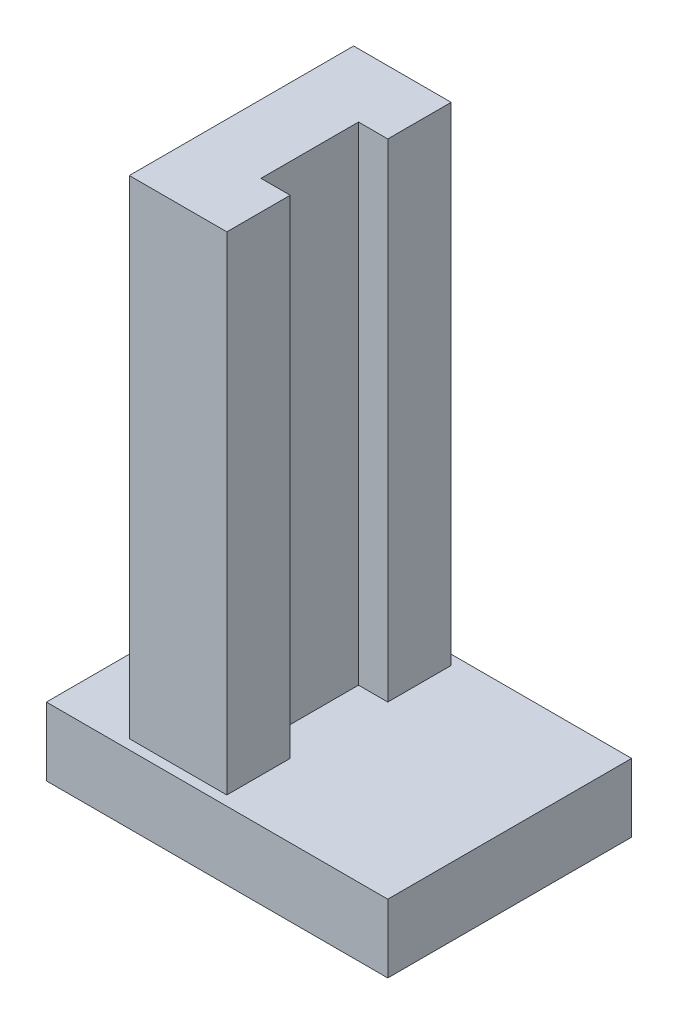
ISO-10303-21;
HEADER;
FILE_DESCRIPTION(('STEP AP214'),'2;1');
FILE_NAME('part.step','',(''),(''),'','','');
FILE_SCHEMA(('AUTOMOTIVE_DESIGN { 1 0 10303 214 1 1 1 1 }'));
ENDSEC;
DATA;
#1=APPLICATION_CONTEXT('core data for automotive mechanical design processes');
#2=APPLICATION_PROTOCOL_DEFINITION('international standard','automotive_design',2000,#1);
#3=PRODUCT_CONTEXT('',#1,'mechanical');
#4=PRODUCT('Part','Part','',(#3));
#5=PRODUCT_RELATED_PRODUCT_CATEGORY('part','',(#4));
#6=PRODUCT_DEFINITION_FORMATION('','',#4);
#7=PRODUCT_DEFINITION_CONTEXT('part definition',#1,'design');
#8=PRODUCT_DEFINITION('design','',#6,#7);
#9=PRODUCT_DEFINITION_SHAPE('','',#8);
#10=(LENGTH_UNIT() NAMED_UNIT(*) SI_UNIT(.MILLI.,.METRE.));
#11=(NAMED_UNIT(*) PLANE_ANGLE_UNIT() SI_UNIT($,.RADIAN.));
#12=(NAMED_UNIT(*) SI_UNIT($,.STERADIAN.) SOLID_ANGLE_UNIT());
#13=UNCERTAINTY_MEASURE_WITH_UNIT(LENGTH_MEASURE(1.E-05),#10,'distance_accuracy_value','');
#14=(GEOMETRIC_REPRESENTATION_CONTEXT(3) GLOBAL_UNCERTAINTY_ASSIGNED_CONTEXT((#13)) GLOBAL_UNIT_ASSIGNED_CONTEXT((#10,
#11,#12)) REPRESENTATION_CONTEXT('',''));
#15=CARTESIAN_POINT('',(0.,0.,0.));
#16=DIRECTION('',(0.,0.,1.));
#17=DIRECTION('',(1.,0.,0.));
#18=AXIS2_PLACEMENT_3D('',#15,#16,#17);
#19=CARTESIAN_POINT('',(0.,285.,57.5));
#20=DIRECTION('',(-1.,0.,0.));
#21=DIRECTION('',(0.,0.,1.));
#22=AXIS2_PLACEMENT_3D('',#19,#20,#21);
#23=PLANE('',#22);
#24=DIRECTION('',(0.,0.,-1.));
#25=VECTOR('',#24,1.);
#26=CARTESIAN_POINT('',(0.,285.,57.5));
#27=LINE('',#26,#25);
#28=CARTESIAN_POINT('',(0.,285.,-25.));
#29=VERTEX_POINT('',#28);
#30=CARTESIAN_POINT('',(0.,285.,-57.5));
#31=VERTEX_POINT('',#30);
#32=EDGE_CURVE('E157',#29,#31,#27,.T.);
#33=ORIENTED_EDGE('',*,*,#32,.F.);
#34=DIRECTION('',(0.,1.,0.));
#35=VECTOR('',#34,1.);
#36=CARTESIAN_POINT('',(0.,35.,-25.));
#37=LINE('',#36,#35);
#38=CARTESIAN_POINT('',(0.,35.,-25.));
#39=VERTEX_POINT('',#38);
#40=EDGE_CURVE('E266',#39,#29,#37,.T.);
#41=ORIENTED_EDGE('',*,*,#40,.F.);
#42=DIRECTION('',(0.,0.,-1.));
#43=VECTOR('',#42,1.);
#44=CARTESIAN_POINT('',(0.,35.,57.5));
#45=LINE('',#44,#43);
#46=CARTESIAN_POINT('',(0.,35.,-57.5));
#47=VERTEX_POINT('',#46);
#48=EDGE_CURVE('E166',#39,#47,#45,.T.);
#49=ORIENTED_EDGE('',*,*,#48,.T.);
#50=DIRECTION('',(0.,-1.,0.));
#51=VECTOR('',#50,1.);
#52=CARTESIAN_POINT('',(0.,285.,-57.5));
#53=LINE('',#52,#51);
#54=EDGE_CURVE('E174',#31,#47,#53,.T.);
#55=ORIENTED_EDGE('',*,*,#54,.F.);
#56=EDGE_LOOP('',(#33,#41,#49,#55));
#57=FACE_BOUND('',#56,.T.);
#58=ADVANCED_FACE('F34',(#57),#23,.F.);
#59=CARTESIAN_POINT('',(0.,35.,0.));
#60=DIRECTION('',(0.,-1.,0.));
#61=DIRECTION('',(0.,0.,-1.));
#62=AXIS2_PLACEMENT_3D('',#59,#60,#61);
#63=PLANE('',#62);
#64=DIRECTION('',(0.,0.,-1.));
#65=VECTOR('',#64,1.);
#66=CARTESIAN_POINT('',(87.5,35.,62.5));
#67=LINE('',#66,#65);
#68=CARTESIAN_POINT('',(87.5,35.,62.5));
#69=VERTEX_POINT('',#68);
#70=CARTESIAN_POINT('',(87.5,35.,-62.5));
#71=VERTEX_POINT('',#70);
#72=EDGE_CURVE('E183',#69,#71,#67,.T.);
#73=ORIENTED_EDGE('',*,*,#72,.T.);
#74=DIRECTION('',(-1.,0.,0.));
#75=VECTOR('',#74,1.);
#76=CARTESIAN_POINT('',(-87.5,35.,-62.5));
#77=LINE('',#76,#75);
#78=CARTESIAN_POINT('',(-87.5,35.,-62.5));
#79=VERTEX_POINT('',#78);
#80=EDGE_CURVE('E186',#71,#79,#77,.T.);
#81=ORIENTED_EDGE('',*,*,#80,.T.);
#82=DIRECTION('',(0.,0.,1.));
#83=VECTOR('',#82,1.);
#84=CARTESIAN_POINT('',(-87.5,35.,62.5));
#85=LINE('',#84,#83);
#86=CARTESIAN_POINT('',(-87.5,35.,62.5));
#87=VERTEX_POINT('',#86);
#88=EDGE_CURVE('E189',#79,#87,#85,.T.);
#89=ORIENTED_EDGE('',*,*,#88,.T.);
#90=DIRECTION('',(1.,0.,0.));
#91=VECTOR('',#90,1.);
#92=CARTESIAN_POINT('',(-87.5,35.,62.5));
#93=LINE('',#92,#91);
#94=EDGE_CURVE('E191',#87,#69,#93,.T.);
#95=ORIENTED_EDGE('',*,*,#94,.T.);
#96=EDGE_LOOP('',(#73,#81,#89,#95));
#97=FACE_BOUND('',#96,.T.);
#98=DIRECTION('',(0.,0.,1.));
#99=VECTOR('',#98,1.);
#100=CARTESIAN_POINT('',(-50.,35.,57.5));
#101=LINE('',#100,#99);
#102=CARTESIAN_POINT('',(-50.,35.,-57.5));
#103=VERTEX_POINT('',#102);
#104=CARTESIAN_POINT('',(-50.,35.,57.5));
#105=VERTEX_POINT('',#104);
#106=EDGE_CURVE('E162',#103,#105,#101,.T.);
#107=ORIENTED_EDGE('',*,*,#106,.F.);
#108=DIRECTION('',(-1.,0.,0.));
#109=VECTOR('',#108,1.);
#110=CARTESIAN_POINT('',(0.,35.,-57.5));
#111=LINE('',#110,#109);
#112=EDGE_CURVE('E155',#47,#103,#111,.T.);
#113=ORIENTED_EDGE('',*,*,#112,.F.);
#114=ORIENTED_EDGE('',*,*,#48,.F.);
#115=DIRECTION('',(1.,0.,0.));
#116=VECTOR('',#115,1.);
#117=CARTESIAN_POINT('',(-15.,35.,-25.));
#118=LINE('',#117,#116);
#119=CARTESIAN_POINT('',(-15.,35.,-25.));
#120=VERTEX_POINT('',#119);
#121=EDGE_CURVE('E146',#120,#39,#118,.T.);
#122=ORIENTED_EDGE('',*,*,#121,.F.);
#123=DIRECTION('',(0.,0.,-1.));
#124=VECTOR('',#123,1.);
#125=CARTESIAN_POINT('',(-15.,35.,25.));
#126=LINE('',#125,#124);
#127=CARTESIAN_POINT('',(-15.,35.,25.));
#128=VERTEX_POINT('',#127);
#129=EDGE_CURVE('E132',#128,#120,#126,.T.);
#130=ORIENTED_EDGE('',*,*,#129,.F.);
#131=DIRECTION('',(1.,0.,0.));
#132=VECTOR('',#131,1.);
#133=CARTESIAN_POINT('',(-15.,35.,25.));
#134=LINE('',#133,#132);
#135=CARTESIAN_POINT('',(0.,35.,25.));
#136=VERTEX_POINT('',#135);
#137=EDGE_CURVE('E130',#128,#136,#134,.T.);
#138=ORIENTED_EDGE('',*,*,#137,.T.);
#139=CARTESIAN_POINT('',(0.,35.,57.5));
#140=VERTEX_POINT('',#139);
#141=EDGE_CURVE('E167',#140,#136,#45,.T.);
#142=ORIENTED_EDGE('',*,*,#141,.F.);
#143=DIRECTION('',(1.,0.,0.));
#144=VECTOR('',#143,1.);
#145=CARTESIAN_POINT('',(0.,35.,57.5));
#146=LINE('',#145,#144);
#147=EDGE_CURVE('E57',#105,#140,#146,.T.);
#148=ORIENTED_EDGE('',*,*,#147,.F.);
#149=EDGE_LOOP('',(#107,#113,#114,#122,#130,#138,#142,#148));
#150=FACE_BOUND('',#149,.T.);
#151=ADVANCED_FACE('F225',(#97,#150),#63,.F.);
#152=CARTESIAN_POINT('',(87.5,35.,62.5));
#153=DIRECTION('',(-1.,0.,0.));
#154=DIRECTION('',(0.,0.,1.));
#155=AXIS2_PLACEMENT_3D('',#152,#153,#154);
#156=PLANE('',#155);
#157=DIRECTION('',(0.,0.,-1.));
#158=VECTOR('',#157,1.);
#159=CARTESIAN_POINT('',(87.5,0.,62.5));
#160=LINE('',#159,#158);
#161=CARTESIAN_POINT('',(87.5,0.,62.5));
#162=VERTEX_POINT('',#161);
#163=CARTESIAN_POINT('',(87.5,0.,-62.5));
#164=VERTEX_POINT('',#163);
#165=EDGE_CURVE('E182',#162,#164,#160,.T.);
#166=ORIENTED_EDGE('',*,*,#165,.T.);
#167=DIRECTION('',(0.,-1.,0.));
#168=VECTOR('',#167,1.);
#169=CARTESIAN_POINT('',(87.5,35.,-62.5));
#170=LINE('',#169,#168);
#171=EDGE_CURVE('E11',#71,#164,#170,.T.);
#172=ORIENTED_EDGE('',*,*,#171,.F.);
#173=ORIENTED_EDGE('',*,*,#72,.F.);
#174=DIRECTION('',(0.,-1.,0.));
#175=VECTOR('',#174,1.);
#176=CARTESIAN_POINT('',(87.5,35.,62.5));
#177=LINE('',#176,#175);
#178=EDGE_CURVE('E193',#69,#162,#177,.T.);
#179=ORIENTED_EDGE('',*,*,#178,.T.);
#180=EDGE_LOOP('',(#166,#172,#173,#179));
#181=FACE_BOUND('',#180,.T.);
#182=ADVANCED_FACE('F36',(#181),#156,.F.);
#183=CARTESIAN_POINT('',(-87.5,35.,-62.5));
#184=DIRECTION('',(0.,0.,1.));
#185=DIRECTION('',(1.,0.,0.));
#186=AXIS2_PLACEMENT_3D('',#183,#184,#185);
#187=PLANE('',#186);
#188=DIRECTION('',(-1.,0.,0.));
#189=VECTOR('',#188,1.);
#190=CARTESIAN_POINT('',(-87.5,0.,-62.5));
#191=LINE('',#190,#189);
#192=CARTESIAN_POINT('',(-87.5,0.,-62.5));
#193=VERTEX_POINT('',#192);
#194=EDGE_CURVE('E196',#164,#193,#191,.T.);
#195=ORIENTED_EDGE('',*,*,#194,.T.);
#196=DIRECTION('',(0.,-1.,0.));
#197=VECTOR('',#196,1.);
#198=CARTESIAN_POINT('',(-87.5,35.,-62.5));
#199=LINE('',#198,#197);
#200=EDGE_CURVE('E42',#79,#193,#199,.T.);
#201=ORIENTED_EDGE('',*,*,#200,.F.);
#202=ORIENTED_EDGE('',*,*,#80,.F.);
#203=ORIENTED_EDGE('',*,*,#171,.T.);
#204=EDGE_LOOP('',(#195,#201,#202,#203));
#205=FACE_BOUND('',#204,.T.);
#206=ADVANCED_FACE('F226',(#205),#187,.F.);
#207=CARTESIAN_POINT('',(-87.5,35.,62.5));
#208=DIRECTION('',(1.,0.,0.));
#209=DIRECTION('',(0.,0.,-1.));
#210=AXIS2_PLACEMENT_3D('',#207,#208,#209);
#211=PLANE('',#210);
#212=DIRECTION('',(0.,0.,1.));
#213=VECTOR('',#212,1.);
#214=CARTESIAN_POINT('',(-87.5,0.,62.5));
#215=LINE('',#214,#213);
#216=CARTESIAN_POINT('',(-87.5,0.,62.5));
#217=VERTEX_POINT('',#216);
#218=EDGE_CURVE('E198',#193,#217,#215,.T.);
#219=ORIENTED_EDGE('',*,*,#218,.T.);
#220=DIRECTION('',(0.,-1.,0.));
#221=VECTOR('',#220,1.);
#222=CARTESIAN_POINT('',(-87.5,35.,62.5));
#223=LINE('',#222,#221);
#224=EDGE_CURVE('E203',#87,#217,#223,.T.);
#225=ORIENTED_EDGE('',*,*,#224,.F.);
#226=ORIENTED_EDGE('',*,*,#88,.F.);
#227=ORIENTED_EDGE('',*,*,#200,.T.);
#228=EDGE_LOOP('',(#219,#225,#226,#227));
#229=FACE_BOUND('',#228,.T.);
#230=ADVANCED_FACE('F210',(#229),#211,.F.);
#231=CARTESIAN_POINT('',(-87.5,35.,62.5));
#232=DIRECTION('',(0.,0.,-1.));
#233=DIRECTION('',(-1.,0.,0.));
#234=AXIS2_PLACEMENT_3D('',#231,#232,#233);
#235=PLANE('',#234);
#236=DIRECTION('',(1.,0.,0.));
#237=VECTOR('',#236,1.);
#238=CARTESIAN_POINT('',(-87.5,0.,62.5));
#239=LINE('',#238,#237);
#240=EDGE_CURVE('E187',#217,#162,#239,.T.);
#241=ORIENTED_EDGE('',*,*,#240,.T.);
#242=ORIENTED_EDGE('',*,*,#178,.F.);
#243=ORIENTED_EDGE('',*,*,#94,.F.);
#244=ORIENTED_EDGE('',*,*,#224,.T.);
#245=EDGE_LOOP('',(#241,#242,#243,#244));
#246=FACE_BOUND('',#245,.T.);
#247=ADVANCED_FACE('F219',(#246),#235,.F.);
#248=CARTESIAN_POINT('',(0.,0.,0.));
#249=DIRECTION('',(0.,-1.,0.));
#250=DIRECTION('',(0.,0.,-1.));
#251=AXIS2_PLACEMENT_3D('',#248,#249,#250);
#252=PLANE('',#251);
#253=ORIENTED_EDGE('',*,*,#165,.F.);
#254=ORIENTED_EDGE('',*,*,#240,.F.);
#255=ORIENTED_EDGE('',*,*,#218,.F.);
#256=ORIENTED_EDGE('',*,*,#194,.F.);
#257=EDGE_LOOP('',(#253,#254,#255,#256));
#258=FACE_BOUND('',#257,.T.);
#259=ADVANCED_FACE('F216',(#258),#252,.T.);
#260=CARTESIAN_POINT('',(-50.,285.,57.5));
#261=DIRECTION('',(1.,0.,0.));
#262=DIRECTION('',(0.,0.,-1.));
#263=AXIS2_PLACEMENT_3D('',#260,#261,#262);
#264=PLANE('',#263);
#265=ORIENTED_EDGE('',*,*,#106,.T.);
#266=DIRECTION('',(0.,-1.,0.));
#267=VECTOR('',#266,1.);
#268=CARTESIAN_POINT('',(-50.,285.,57.5));
#269=LINE('',#268,#267);
#270=CARTESIAN_POINT('',(-50.,285.,57.5));
#271=VERTEX_POINT('',#270);
#272=EDGE_CURVE('E180',#271,#105,#269,.T.);
#273=ORIENTED_EDGE('',*,*,#272,.F.);
#274=DIRECTION('',(0.,0.,1.));
#275=VECTOR('',#274,1.);
#276=CARTESIAN_POINT('',(-50.,285.,57.5));
#277=LINE('',#276,#275);
#278=CARTESIAN_POINT('',(-50.,285.,-57.5));
#279=VERTEX_POINT('',#278);
#280=EDGE_CURVE('E151',#279,#271,#277,.T.);
#281=ORIENTED_EDGE('',*,*,#280,.F.);
#282=DIRECTION('',(0.,-1.,0.));
#283=VECTOR('',#282,1.);
#284=CARTESIAN_POINT('',(-50.,285.,-57.5));
#285=LINE('',#284,#283);
#286=EDGE_CURVE('E161',#279,#103,#285,.T.);
#287=ORIENTED_EDGE('',*,*,#286,.T.);
#288=EDGE_LOOP('',(#265,#273,#281,#287));
#289=FACE_BOUND('',#288,.T.);
#290=ADVANCED_FACE('F253',(#289),#264,.F.);
#291=CARTESIAN_POINT('',(0.,285.,57.5));
#292=DIRECTION('',(0.,0.,-1.));
#293=DIRECTION('',(-1.,0.,0.));
#294=AXIS2_PLACEMENT_3D('',#291,#292,#293);
#295=PLANE('',#294);
#296=ORIENTED_EDGE('',*,*,#147,.T.);
#297=DIRECTION('',(0.,-1.,0.));
#298=VECTOR('',#297,1.);
#299=CARTESIAN_POINT('',(0.,285.,57.5));
#300=LINE('',#299,#298);
#301=CARTESIAN_POINT('',(0.,285.,57.5));
#302=VERTEX_POINT('',#301);
#303=EDGE_CURVE('E177',#302,#140,#300,.T.);
#304=ORIENTED_EDGE('',*,*,#303,.F.);
#305=DIRECTION('',(1.,0.,0.));
#306=VECTOR('',#305,1.);
#307=CARTESIAN_POINT('',(0.,285.,57.5));
#308=LINE('',#307,#306);
#309=EDGE_CURVE('E154',#271,#302,#308,.T.);
#310=ORIENTED_EDGE('',*,*,#309,.F.);
#311=ORIENTED_EDGE('',*,*,#272,.T.);
#312=EDGE_LOOP('',(#296,#304,#310,#311));
#313=FACE_BOUND('',#312,.T.);
#314=ADVANCED_FACE('F246',(#313),#295,.F.);
#315=ORIENTED_EDGE('',*,*,#141,.T.);
#316=DIRECTION('',(0.,-1.,0.));
#317=VECTOR('',#316,1.);
#318=CARTESIAN_POINT('',(0.,35.,25.));
#319=LINE('',#318,#317);
#320=CARTESIAN_POINT('',(0.,285.,25.));
#321=VERTEX_POINT('',#320);
#322=EDGE_CURVE('E255',#321,#136,#319,.T.);
#323=ORIENTED_EDGE('',*,*,#322,.F.);
#324=EDGE_CURVE('E143',#302,#321,#27,.T.);
#325=ORIENTED_EDGE('',*,*,#324,.F.);
#326=ORIENTED_EDGE('',*,*,#303,.T.);
#327=EDGE_LOOP('',(#315,#323,#325,#326));
#328=FACE_BOUND('',#327,.T.);
#329=ADVANCED_FACE('F236',(#328),#23,.F.);
#330=CARTESIAN_POINT('',(0.,285.,-57.5));
#331=DIRECTION('',(0.,0.,1.));
#332=DIRECTION('',(1.,0.,0.));
#333=AXIS2_PLACEMENT_3D('',#330,#331,#332);
#334=PLANE('',#333);
#335=ORIENTED_EDGE('',*,*,#112,.T.);
#336=ORIENTED_EDGE('',*,*,#286,.F.);
#337=DIRECTION('',(-1.,0.,0.));
#338=VECTOR('',#337,1.);
#339=CARTESIAN_POINT('',(0.,285.,-57.5));
#340=LINE('',#339,#338);
#341=EDGE_CURVE('E159',#31,#279,#340,.T.);
#342=ORIENTED_EDGE('',*,*,#341,.F.);
#343=ORIENTED_EDGE('',*,*,#54,.T.);
#344=EDGE_LOOP('',(#335,#336,#342,#343));
#345=FACE_BOUND('',#344,.T.);
#346=ADVANCED_FACE('F245',(#345),#334,.F.);
#347=CARTESIAN_POINT('',(0.,285.,0.));
#348=DIRECTION('',(0.,1.,0.));
#349=DIRECTION('',(0.,0.,1.));
#350=AXIS2_PLACEMENT_3D('',#347,#348,#349);
#351=PLANE('',#350);
#352=DIRECTION('',(1.,0.,0.));
#353=VECTOR('',#352,1.);
#354=CARTESIAN_POINT('',(-15.,285.,-25.));
#355=LINE('',#354,#353);
#356=CARTESIAN_POINT('',(-15.,285.,-25.));
#357=VERTEX_POINT('',#356);
#358=EDGE_CURVE('E144',#357,#29,#355,.T.);
#359=ORIENTED_EDGE('',*,*,#358,.T.);
#360=ORIENTED_EDGE('',*,*,#32,.T.);
#361=ORIENTED_EDGE('',*,*,#341,.T.);
#362=ORIENTED_EDGE('',*,*,#280,.T.);
#363=ORIENTED_EDGE('',*,*,#309,.T.);
#364=ORIENTED_EDGE('',*,*,#324,.T.);
#365=DIRECTION('',(1.,0.,0.));
#366=VECTOR('',#365,1.);
#367=CARTESIAN_POINT('',(-15.,285.,25.));
#368=LINE('',#367,#366);
#369=CARTESIAN_POINT('',(-15.,285.,25.));
#370=VERTEX_POINT('',#369);
#371=EDGE_CURVE('E128',#370,#321,#368,.T.);
#372=ORIENTED_EDGE('',*,*,#371,.F.);
#373=DIRECTION('',(0.,0.,1.));
#374=VECTOR('',#373,1.);
#375=CARTESIAN_POINT('',(-15.,285.,25.));
#376=LINE('',#375,#374);
#377=EDGE_CURVE('E133',#357,#370,#376,.T.);
#378=ORIENTED_EDGE('',*,*,#377,.F.);
#379=EDGE_LOOP('',(#359,#360,#361,#362,#363,#364,#372,#378));
#380=FACE_BOUND('',#379,.T.);
#381=ADVANCED_FACE('F141',(#380),#351,.T.);
#382=CARTESIAN_POINT('',(-15.,35.,-25.));
#383=DIRECTION('',(0.,0.,-1.));
#384=DIRECTION('',(-1.,0.,0.));
#385=AXIS2_PLACEMENT_3D('',#382,#383,#384);
#386=PLANE('',#385);
#387=ORIENTED_EDGE('',*,*,#40,.T.);
#388=ORIENTED_EDGE('',*,*,#358,.F.);
#389=DIRECTION('',(0.,1.,0.));
#390=VECTOR('',#389,1.);
#391=CARTESIAN_POINT('',(-15.,35.,-25.));
#392=LINE('',#391,#390);
#393=EDGE_CURVE('E49',#120,#357,#392,.T.);
#394=ORIENTED_EDGE('',*,*,#393,.F.);
#395=ORIENTED_EDGE('',*,*,#121,.T.);
#396=EDGE_LOOP('',(#387,#388,#394,#395));
#397=FACE_BOUND('',#396,.T.);
#398=ADVANCED_FACE('F268',(#397),#386,.F.);
#399=CARTESIAN_POINT('',(-15.,35.,25.));
#400=DIRECTION('',(0.,0.,1.));
#401=DIRECTION('',(1.,0.,0.));
#402=AXIS2_PLACEMENT_3D('',#399,#400,#401);
#403=PLANE('',#402);
#404=ORIENTED_EDGE('',*,*,#322,.T.);
#405=ORIENTED_EDGE('',*,*,#137,.F.);
#406=DIRECTION('',(0.,-1.,0.));
#407=VECTOR('',#406,1.);
#408=CARTESIAN_POINT('',(-15.,35.,25.));
#409=LINE('',#408,#407);
#410=EDGE_CURVE('E124',#370,#128,#409,.T.);
#411=ORIENTED_EDGE('',*,*,#410,.F.);
#412=ORIENTED_EDGE('',*,*,#371,.T.);
#413=EDGE_LOOP('',(#404,#405,#411,#412));
#414=FACE_BOUND('',#413,.T.);
#415=ADVANCED_FACE('F126',(#414),#403,.F.);
#416=CARTESIAN_POINT('',(-15.,0.,0.));
#417=DIRECTION('',(-1.,0.,0.));
#418=DIRECTION('',(0.,0.,1.));
#419=AXIS2_PLACEMENT_3D('',#416,#417,#418);
#420=PLANE('',#419);
#421=ORIENTED_EDGE('',*,*,#393,.T.);
#422=ORIENTED_EDGE('',*,*,#377,.T.);
#423=ORIENTED_EDGE('',*,*,#410,.T.);
#424=ORIENTED_EDGE('',*,*,#129,.T.);
#425=EDGE_LOOP('',(#421,#422,#423,#424));
#426=FACE_BOUND('',#425,.T.);
#427=ADVANCED_FACE('F136',(#426),#420,.F.);
#428=CLOSED_SHELL('',(#58,#151,#182,#206,#230,#247,#259,#290,#314,#329,#346,#381,#398,#415,#427));
#429=MANIFOLD_SOLID_BREP('B2',#428);
#430=ADVANCED_BREP_SHAPE_REPRESENTATION('',(#18,#429),#14);
#431=SHAPE_DEFINITION_REPRESENTATION(#9,#430);
ENDSEC;
END-ISO-10303-21;
